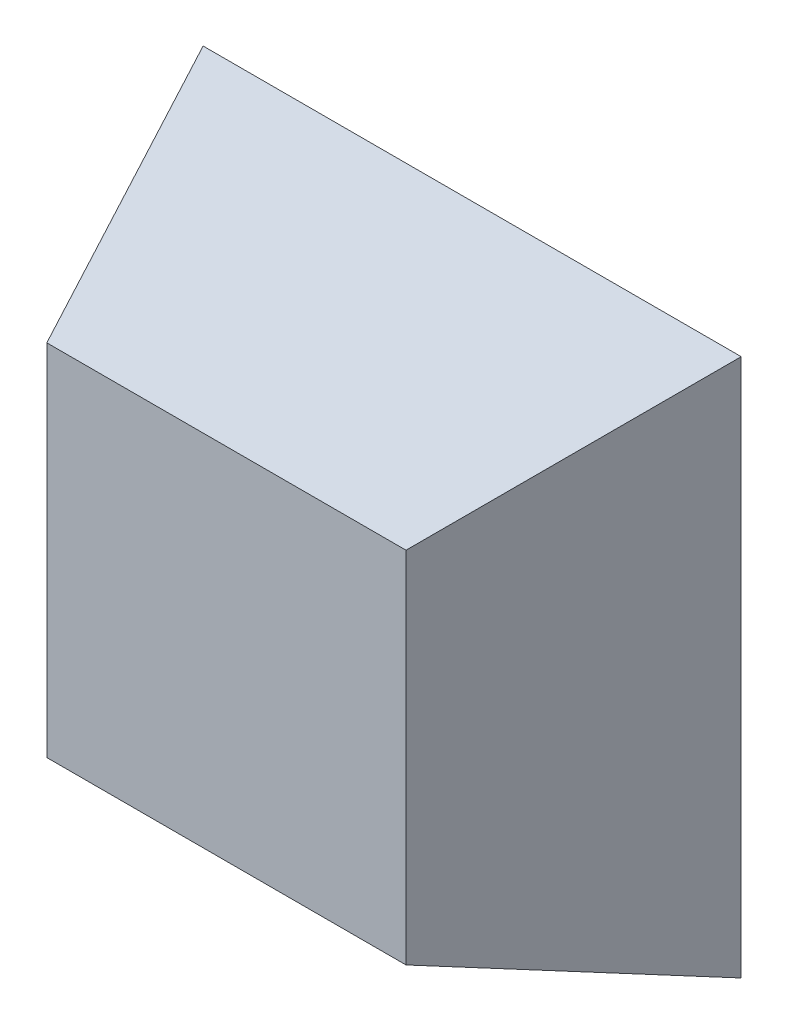
ISO-10303-21;
HEADER;
FILE_DESCRIPTION(('STEP AP214'),'2;1');
FILE_NAME('part.step','',(''),(''),'','','');
FILE_SCHEMA(('AUTOMOTIVE_DESIGN { 1 0 10303 214 1 1 1 1 }'));
ENDSEC;
DATA;
#1=APPLICATION_CONTEXT('core data for automotive mechanical design processes');
#2=APPLICATION_PROTOCOL_DEFINITION('international standard','automotive_design',2000,#1);
#3=PRODUCT_CONTEXT('',#1,'mechanical');
#4=PRODUCT('Part','Part','',(#3));
#5=PRODUCT_RELATED_PRODUCT_CATEGORY('part','',(#4));
#6=PRODUCT_DEFINITION_FORMATION('','',#4);
#7=PRODUCT_DEFINITION_CONTEXT('part definition',#1,'design');
#8=PRODUCT_DEFINITION('design','',#6,#7);
#9=PRODUCT_DEFINITION_SHAPE('','',#8);
#10=(LENGTH_UNIT() NAMED_UNIT(*) SI_UNIT(.MILLI.,.METRE.));
#11=(NAMED_UNIT(*) PLANE_ANGLE_UNIT() SI_UNIT($,.RADIAN.));
#12=(NAMED_UNIT(*) SI_UNIT($,.STERADIAN.) SOLID_ANGLE_UNIT());
#13=UNCERTAINTY_MEASURE_WITH_UNIT(LENGTH_MEASURE(1.E-05),#10,'distance_accuracy_value','');
#14=(GEOMETRIC_REPRESENTATION_CONTEXT(3) GLOBAL_UNCERTAINTY_ASSIGNED_CONTEXT((#13)) GLOBAL_UNIT_ASSIGNED_CONTEXT((#10,
#11,#12)) REPRESENTATION_CONTEXT('',''));
#15=CARTESIAN_POINT('',(0.,0.,0.));
#16=DIRECTION('',(0.,0.,1.));
#17=DIRECTION('',(1.,0.,0.));
#18=AXIS2_PLACEMENT_3D('',#15,#16,#17);
#19=CARTESIAN_POINT('',(91.85,-104.85,-8.32667268468867E-13));
#20=DIRECTION('',(0.939692620785908,0.,0.342020143325669));
#21=DIRECTION('',(0.342020143325669,0.,-0.939692620785908));
#22=AXIS2_PLACEMENT_3D('',#19,#20,#21);
#23=PLANE('',#22);
#24=DIRECTION('',(0.,1.,0.));
#25=VECTOR('',#24,1.);
#26=CARTESIAN_POINT('',(91.85,-104.85,-8.32667268468867E-13));
#27=LINE('',#26,#25);
#28=CARTESIAN_POINT('',(91.85,-104.85,-8.32667268468867E-13));
#29=VERTEX_POINT('',#28);
#30=CARTESIAN_POINT('',(91.85,-92.15,-8.32667268468867E-13));
#31=VERTEX_POINT('',#30);
#32=EDGE_CURVE('E78',#29,#31,#27,.T.);
#33=ORIENTED_EDGE('',*,*,#32,.T.);
#34=DIRECTION('',(0.323615577118185,0.323615577118186,-0.889126490715988));
#35=VECTOR('',#34,1.);
#36=CARTESIAN_POINT('',(91.85,-92.15,-8.32667268468867E-13));
#37=LINE('',#36,#35);
#38=CARTESIAN_POINT('',(89.738972641256,-94.261027358744,5.79999999999919));
#39=VERTEX_POINT('',#38);
#40=EDGE_CURVE('E11',#39,#31,#37,.T.);
#41=ORIENTED_EDGE('',*,*,#40,.F.);
#42=DIRECTION('',(0.,-1.,0.));
#43=VECTOR('',#42,1.);
#44=CARTESIAN_POINT('',(89.738972641256,-104.85,5.79999999999919));
#45=LINE('',#44,#43);
#46=CARTESIAN_POINT('',(89.738972641256,-102.738972641256,5.79999999999919));
#47=VERTEX_POINT('',#46);
#48=EDGE_CURVE('E94',#47,#39,#45,.F.);
#49=ORIENTED_EDGE('',*,*,#48,.F.);
#50=DIRECTION('',(0.323615577118185,-0.323615577118185,-0.889126490715988));
#51=VECTOR('',#50,1.);
#52=CARTESIAN_POINT('',(91.85,-104.85,-8.32667268468867E-13));
#53=LINE('',#52,#51);
#54=EDGE_CURVE('E89',#47,#29,#53,.T.);
#55=ORIENTED_EDGE('',*,*,#54,.T.);
#56=EDGE_LOOP('',(#33,#41,#49,#55));
#57=FACE_BOUND('',#56,.T.);
#58=ADVANCED_FACE('F32',(#57),#23,.T.);
#59=CARTESIAN_POINT('',(91.85,-92.15,-8.32667268468867E-13));
#60=DIRECTION('',(0.,0.939692620785908,0.342020143325669));
#61=DIRECTION('',(0.,-0.342020143325669,0.939692620785908));
#62=AXIS2_PLACEMENT_3D('',#59,#60,#61);
#63=PLANE('',#62);
#64=DIRECTION('',(-1.,0.,0.));
#65=VECTOR('',#64,1.);
#66=CARTESIAN_POINT('',(91.85,-92.15,-8.32667268468867E-13));
#67=LINE('',#66,#65);
#68=CARTESIAN_POINT('',(79.15,-92.15,-8.32667268468867E-13));
#69=VERTEX_POINT('',#68);
#70=EDGE_CURVE('E74',#31,#69,#67,.T.);
#71=ORIENTED_EDGE('',*,*,#70,.T.);
#72=DIRECTION('',(-0.323615577118185,0.323615577118185,-0.889126490715988));
#73=VECTOR('',#72,1.);
#74=CARTESIAN_POINT('',(79.15,-92.15,-8.32667268468867E-13));
#75=LINE('',#74,#73);
#76=CARTESIAN_POINT('',(81.261027358744,-94.261027358744,5.79999999999919));
#77=VERTEX_POINT('',#76);
#78=EDGE_CURVE('E41',#77,#69,#75,.T.);
#79=ORIENTED_EDGE('',*,*,#78,.F.);
#80=DIRECTION('',(1.,0.,0.));
#81=VECTOR('',#80,1.);
#82=CARTESIAN_POINT('',(91.85,-94.261027358744,5.79999999999919));
#83=LINE('',#82,#81);
#84=EDGE_CURVE('E85',#39,#77,#83,.F.);
#85=ORIENTED_EDGE('',*,*,#84,.F.);
#86=ORIENTED_EDGE('',*,*,#40,.T.);
#87=EDGE_LOOP('',(#71,#79,#85,#86));
#88=FACE_BOUND('',#87,.T.);
#89=ADVANCED_FACE('F34',(#88),#63,.T.);
#90=CARTESIAN_POINT('',(79.15,-92.15,-8.32667268468867E-13));
#91=DIRECTION('',(-0.939692620785908,0.,0.342020143325669));
#92=DIRECTION('',(0.342020143325669,0.,0.939692620785908));
#93=AXIS2_PLACEMENT_3D('',#90,#91,#92);
#94=PLANE('',#93);
#95=DIRECTION('',(0.,-1.,0.));
#96=VECTOR('',#95,1.);
#97=CARTESIAN_POINT('',(79.15,-92.15,-8.32667268468867E-13));
#98=LINE('',#97,#96);
#99=CARTESIAN_POINT('',(79.15,-104.85,-8.32667268468867E-13));
#100=VERTEX_POINT('',#99);
#101=EDGE_CURVE('E79',#69,#100,#98,.T.);
#102=ORIENTED_EDGE('',*,*,#101,.T.);
#103=DIRECTION('',(-0.323615577118185,-0.323615577118186,-0.889126490715988));
#104=VECTOR('',#103,1.);
#105=CARTESIAN_POINT('',(79.15,-104.85,-8.32667268468867E-13));
#106=LINE('',#105,#104);
#107=CARTESIAN_POINT('',(81.261027358744,-102.738972641256,5.79999999999919));
#108=VERTEX_POINT('',#107);
#109=EDGE_CURVE('E97',#108,#100,#106,.T.);
#110=ORIENTED_EDGE('',*,*,#109,.F.);
#111=DIRECTION('',(0.,1.,0.));
#112=VECTOR('',#111,1.);
#113=CARTESIAN_POINT('',(81.261027358744,-92.15,5.79999999999919));
#114=LINE('',#113,#112);
#115=EDGE_CURVE('E53',#77,#108,#114,.F.);
#116=ORIENTED_EDGE('',*,*,#115,.F.);
#117=ORIENTED_EDGE('',*,*,#78,.T.);
#118=EDGE_LOOP('',(#102,#110,#116,#117));
#119=FACE_BOUND('',#118,.T.);
#120=ADVANCED_FACE('F104',(#119),#94,.T.);
#121=CARTESIAN_POINT('',(79.15,-104.85,-8.32667268468867E-13));
#122=DIRECTION('',(0.,-0.939692620785908,0.342020143325669));
#123=DIRECTION('',(0.,-0.342020143325669,-0.939692620785908));
#124=AXIS2_PLACEMENT_3D('',#121,#122,#123);
#125=PLANE('',#124);
#126=DIRECTION('',(1.,0.,0.));
#127=VECTOR('',#126,1.);
#128=CARTESIAN_POINT('',(79.15,-104.85,-8.32667268468867E-13));
#129=LINE('',#128,#127);
#130=EDGE_CURVE('E93',#100,#29,#129,.T.);
#131=ORIENTED_EDGE('',*,*,#130,.T.);
#132=ORIENTED_EDGE('',*,*,#54,.F.);
#133=DIRECTION('',(-1.,0.,0.));
#134=VECTOR('',#133,1.);
#135=CARTESIAN_POINT('',(79.15,-102.738972641256,5.79999999999919));
#136=LINE('',#135,#134);
#137=EDGE_CURVE('E36',#108,#47,#136,.F.);
#138=ORIENTED_EDGE('',*,*,#137,.F.);
#139=ORIENTED_EDGE('',*,*,#109,.T.);
#140=EDGE_LOOP('',(#131,#132,#138,#139));
#141=FACE_BOUND('',#140,.T.);
#142=ADVANCED_FACE('F106',(#141),#125,.T.);
#143=CARTESIAN_POINT('',(91.85,-92.15,5.79999999999919));
#144=DIRECTION('',(0.,0.,1.));
#145=DIRECTION('',(1.,0.,0.));
#146=AXIS2_PLACEMENT_3D('',#143,#144,#145);
#147=PLANE('',#146);
#148=ORIENTED_EDGE('',*,*,#48,.T.);
#149=ORIENTED_EDGE('',*,*,#84,.T.);
#150=ORIENTED_EDGE('',*,*,#115,.T.);
#151=ORIENTED_EDGE('',*,*,#137,.T.);
#152=EDGE_LOOP('',(#148,#149,#150,#151));
#153=FACE_BOUND('',#152,.T.);
#154=ADVANCED_FACE('F102',(#153),#147,.T.);
#155=CARTESIAN_POINT('',(91.85,-92.15,-8.32667268468867E-13));
#156=DIRECTION('',(0.,0.,1.));
#157=DIRECTION('',(1.,0.,0.));
#158=AXIS2_PLACEMENT_3D('',#155,#156,#157);
#159=PLANE('',#158);
#160=ORIENTED_EDGE('',*,*,#32,.F.);
#161=ORIENTED_EDGE('',*,*,#130,.F.);
#162=ORIENTED_EDGE('',*,*,#101,.F.);
#163=ORIENTED_EDGE('',*,*,#70,.F.);
#164=EDGE_LOOP('',(#160,#161,#162,#163));
#165=FACE_BOUND('',#164,.T.);
#166=ADVANCED_FACE('F75',(#165),#159,.F.);
#167=CLOSED_SHELL('',(#58,#89,#120,#142,#154,#166));
#168=MANIFOLD_SOLID_BREP('B2',#167);
#169=ADVANCED_BREP_SHAPE_REPRESENTATION('',(#18,#168),#14);
#170=SHAPE_DEFINITION_REPRESENTATION(#9,#169);
ENDSEC;
END-ISO-10303-21;
